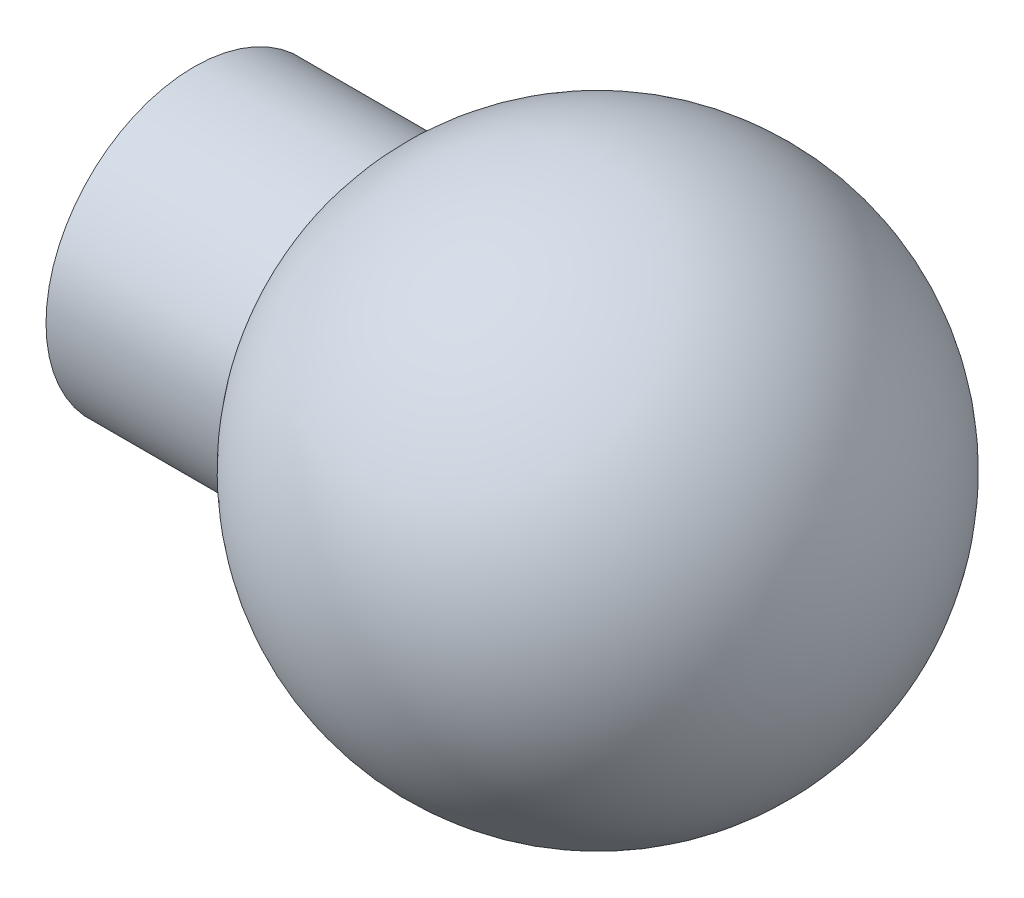
ISO-10303-21;
HEADER;
FILE_DESCRIPTION(('STEP AP214'),'2;1');
FILE_NAME('part.step','',(''),(''),'','','');
FILE_SCHEMA(('AUTOMOTIVE_DESIGN { 1 0 10303 214 1 1 1 1 }'));
ENDSEC;
DATA;
#1=APPLICATION_CONTEXT('core data for automotive mechanical design processes');
#2=APPLICATION_PROTOCOL_DEFINITION('international standard','automotive_design',2000,#1);
#3=PRODUCT_CONTEXT('',#1,'mechanical');
#4=PRODUCT('Part','Part','',(#3));
#5=PRODUCT_RELATED_PRODUCT_CATEGORY('part','',(#4));
#6=PRODUCT_DEFINITION_FORMATION('','',#4);
#7=PRODUCT_DEFINITION_CONTEXT('part definition',#1,'design');
#8=PRODUCT_DEFINITION('design','',#6,#7);
#9=PRODUCT_DEFINITION_SHAPE('','',#8);
#10=(LENGTH_UNIT() NAMED_UNIT(*) SI_UNIT(.MILLI.,.METRE.));
#11=(NAMED_UNIT(*) PLANE_ANGLE_UNIT() SI_UNIT($,.RADIAN.));
#12=(NAMED_UNIT(*) SI_UNIT($,.STERADIAN.) SOLID_ANGLE_UNIT());
#13=UNCERTAINTY_MEASURE_WITH_UNIT(LENGTH_MEASURE(1.E-05),#10,'distance_accuracy_value','');
#14=(GEOMETRIC_REPRESENTATION_CONTEXT(3) GLOBAL_UNCERTAINTY_ASSIGNED_CONTEXT((#13)) GLOBAL_UNIT_ASSIGNED_CONTEXT((#10,
#11,#12)) REPRESENTATION_CONTEXT('',''));
#15=CARTESIAN_POINT('',(0.,0.,0.));
#16=DIRECTION('',(0.,0.,1.));
#17=DIRECTION('',(1.,0.,0.));
#18=AXIS2_PLACEMENT_3D('',#15,#16,#17);
#19=CARTESIAN_POINT('',(-30.,0.,0.));
#20=DIRECTION('',(1.,0.,0.));
#21=DIRECTION('',(0.,0.,-1.));
#22=AXIS2_PLACEMENT_3D('',#19,#20,#21);
#23=CYLINDRICAL_SURFACE('',#22,11.);
#24=CARTESIAN_POINT('',(-30.,0.,0.));
#25=DIRECTION('',(1.,0.,0.));
#26=DIRECTION('',(0.,0.,-1.));
#27=AXIS2_PLACEMENT_3D('',#24,#25,#26);
#28=CIRCLE('',#27,11.);
#29=CARTESIAN_POINT('',(-30.,0.,-11.));
#30=VERTEX_POINT('',#29);
#31=EDGE_CURVE('E44',#30,#30,#28,.T.);
#32=ORIENTED_EDGE('',*,*,#31,.T.);
#33=EDGE_LOOP('',(#32));
#34=FACE_BOUND('',#33,.T.);
#35=CARTESIAN_POINT('',(-16.7032930884901,0.,0.));
#36=DIRECTION('',(1.,0.,0.));
#37=DIRECTION('',(0.,0.,-1.));
#38=AXIS2_PLACEMENT_3D('',#35,#36,#37);
#39=CIRCLE('',#38,11.);
#40=CARTESIAN_POINT('',(-16.7032930884901,0.,-11.));
#41=VERTEX_POINT('',#40);
#42=EDGE_CURVE('E11',#41,#41,#39,.T.);
#43=ORIENTED_EDGE('',*,*,#42,.F.);
#44=EDGE_LOOP('',(#43));
#45=FACE_BOUND('',#44,.T.);
#46=ADVANCED_FACE('F36',(#34,#45),#23,.T.);
#47=CARTESIAN_POINT('',(-30.,0.,0.));
#48=DIRECTION('',(1.,0.,0.));
#49=DIRECTION('',(0.,0.,-1.));
#50=AXIS2_PLACEMENT_3D('',#47,#48,#49);
#51=PLANE('',#50);
#52=DIRECTION('',(0.,0.,-1.));
#53=VECTOR('',#52,1.);
#54=CARTESIAN_POINT('',(-30.,3.5,-3.5));
#55=LINE('',#54,#53);
#56=CARTESIAN_POINT('',(-30.,3.5,3.5));
#57=VERTEX_POINT('',#56);
#58=CARTESIAN_POINT('',(-30.,3.5,-3.5));
#59=VERTEX_POINT('',#58);
#60=EDGE_CURVE('E86',#57,#59,#55,.T.);
#61=ORIENTED_EDGE('',*,*,#60,.F.);
#62=DIRECTION('',(0.,1.,0.));
#63=VECTOR('',#62,1.);
#64=CARTESIAN_POINT('',(-30.,-3.5,3.5));
#65=LINE('',#64,#63);
#66=CARTESIAN_POINT('',(-30.,-3.5,3.5));
#67=VERTEX_POINT('',#66);
#68=EDGE_CURVE('E51',#67,#57,#65,.T.);
#69=ORIENTED_EDGE('',*,*,#68,.F.);
#70=DIRECTION('',(0.,0.,1.));
#71=VECTOR('',#70,1.);
#72=CARTESIAN_POINT('',(-30.,-3.5,-3.5));
#73=LINE('',#72,#71);
#74=CARTESIAN_POINT('',(-30.,-3.5,-3.5));
#75=VERTEX_POINT('',#74);
#76=EDGE_CURVE('E102',#75,#67,#73,.T.);
#77=ORIENTED_EDGE('',*,*,#76,.F.);
#78=DIRECTION('',(0.,-1.,0.));
#79=VECTOR('',#78,1.);
#80=CARTESIAN_POINT('',(-30.,-3.5,-3.5));
#81=LINE('',#80,#79);
#82=EDGE_CURVE('E108',#59,#75,#81,.T.);
#83=ORIENTED_EDGE('',*,*,#82,.F.);
#84=EDGE_LOOP('',(#61,#69,#77,#83));
#85=FACE_BOUND('',#84,.T.);
#86=ORIENTED_EDGE('',*,*,#31,.F.);
#87=EDGE_LOOP('',(#86));
#88=FACE_BOUND('',#87,.T.);
#89=ADVANCED_FACE('F118',(#85,#88),#51,.F.);
#90=CARTESIAN_POINT('',(0.,0.,0.));
#91=DIRECTION('',(-1.,0.,0.));
#92=DIRECTION('',(0.,1.,0.));
#93=AXIS2_PLACEMENT_3D('',#90,#91,#92);
#94=SPHERICAL_SURFACE('',#93,20.);
#95=ORIENTED_EDGE('',*,*,#42,.T.);
#96=EDGE_LOOP('',(#95));
#97=FACE_BOUND('',#96,.T.);
#98=ADVANCED_FACE('F38',(#97),#94,.T.);
#99=CARTESIAN_POINT('',(-24.,-3.5,3.5));
#100=DIRECTION('',(0.,0.,1.));
#101=DIRECTION('',(1.,0.,0.));
#102=AXIS2_PLACEMENT_3D('',#99,#100,#101);
#103=PLANE('',#102);
#104=ORIENTED_EDGE('',*,*,#68,.T.);
#105=DIRECTION('',(-1.,0.,0.));
#106=VECTOR('',#105,1.);
#107=CARTESIAN_POINT('',(-24.,3.5,3.5));
#108=LINE('',#107,#106);
#109=CARTESIAN_POINT('',(-24.,3.5,3.5));
#110=VERTEX_POINT('',#109);
#111=EDGE_CURVE('E74',#110,#57,#108,.T.);
#112=ORIENTED_EDGE('',*,*,#111,.F.);
#113=DIRECTION('',(0.,1.,0.));
#114=VECTOR('',#113,1.);
#115=CARTESIAN_POINT('',(-24.,-3.5,3.5));
#116=LINE('',#115,#114);
#117=CARTESIAN_POINT('',(-24.,-3.5,3.5));
#118=VERTEX_POINT('',#117);
#119=EDGE_CURVE('E100',#118,#110,#116,.T.);
#120=ORIENTED_EDGE('',*,*,#119,.F.);
#121=DIRECTION('',(-1.,0.,0.));
#122=VECTOR('',#121,1.);
#123=CARTESIAN_POINT('',(-24.,-3.5,3.5));
#124=LINE('',#123,#122);
#125=EDGE_CURVE('E59',#118,#67,#124,.T.);
#126=ORIENTED_EDGE('',*,*,#125,.T.);
#127=EDGE_LOOP('',(#104,#112,#120,#126));
#128=FACE_BOUND('',#127,.T.);
#129=ADVANCED_FACE('F126',(#128),#103,.F.);
#130=CARTESIAN_POINT('',(-24.,-3.5,-3.5));
#131=DIRECTION('',(0.,-1.,0.));
#132=DIRECTION('',(0.,0.,-1.));
#133=AXIS2_PLACEMENT_3D('',#130,#131,#132);
#134=PLANE('',#133);
#135=ORIENTED_EDGE('',*,*,#76,.T.);
#136=ORIENTED_EDGE('',*,*,#125,.F.);
#137=DIRECTION('',(0.,0.,1.));
#138=VECTOR('',#137,1.);
#139=CARTESIAN_POINT('',(-24.,-3.5,-3.5));
#140=LINE('',#139,#138);
#141=CARTESIAN_POINT('',(-24.,-3.5,-3.5));
#142=VERTEX_POINT('',#141);
#143=EDGE_CURVE('E97',#142,#118,#140,.T.);
#144=ORIENTED_EDGE('',*,*,#143,.F.);
#145=DIRECTION('',(-1.,0.,0.));
#146=VECTOR('',#145,1.);
#147=CARTESIAN_POINT('',(-24.,-3.5,-3.5));
#148=LINE('',#147,#146);
#149=EDGE_CURVE('E90',#142,#75,#148,.T.);
#150=ORIENTED_EDGE('',*,*,#149,.T.);
#151=EDGE_LOOP('',(#135,#136,#144,#150));
#152=FACE_BOUND('',#151,.T.);
#153=ADVANCED_FACE('F131',(#152),#134,.F.);
#154=CARTESIAN_POINT('',(-24.,-3.5,-3.5));
#155=DIRECTION('',(0.,0.,-1.));
#156=DIRECTION('',(-1.,0.,0.));
#157=AXIS2_PLACEMENT_3D('',#154,#155,#156);
#158=PLANE('',#157);
#159=ORIENTED_EDGE('',*,*,#82,.T.);
#160=ORIENTED_EDGE('',*,*,#149,.F.);
#161=DIRECTION('',(0.,-1.,0.));
#162=VECTOR('',#161,1.);
#163=CARTESIAN_POINT('',(-24.,-3.5,-3.5));
#164=LINE('',#163,#162);
#165=CARTESIAN_POINT('',(-24.,3.5,-3.5));
#166=VERTEX_POINT('',#165);
#167=EDGE_CURVE('E93',#166,#142,#164,.T.);
#168=ORIENTED_EDGE('',*,*,#167,.F.);
#169=DIRECTION('',(-1.,0.,0.));
#170=VECTOR('',#169,1.);
#171=CARTESIAN_POINT('',(-24.,3.5,-3.5));
#172=LINE('',#171,#170);
#173=EDGE_CURVE('E79',#166,#59,#172,.T.);
#174=ORIENTED_EDGE('',*,*,#173,.T.);
#175=EDGE_LOOP('',(#159,#160,#168,#174));
#176=FACE_BOUND('',#175,.T.);
#177=ADVANCED_FACE('F94',(#176),#158,.F.);
#178=CARTESIAN_POINT('',(-24.,3.5,-3.5));
#179=DIRECTION('',(0.,1.,0.));
#180=DIRECTION('',(0.,0.,1.));
#181=AXIS2_PLACEMENT_3D('',#178,#179,#180);
#182=PLANE('',#181);
#183=ORIENTED_EDGE('',*,*,#60,.T.);
#184=ORIENTED_EDGE('',*,*,#173,.F.);
#185=DIRECTION('',(0.,0.,-1.));
#186=VECTOR('',#185,1.);
#187=CARTESIAN_POINT('',(-24.,3.5,-3.5));
#188=LINE('',#187,#186);
#189=EDGE_CURVE('E83',#110,#166,#188,.T.);
#190=ORIENTED_EDGE('',*,*,#189,.F.);
#191=ORIENTED_EDGE('',*,*,#111,.T.);
#192=EDGE_LOOP('',(#183,#184,#190,#191));
#193=FACE_BOUND('',#192,.T.);
#194=ADVANCED_FACE('F81',(#193),#182,.F.);
#195=CARTESIAN_POINT('',(-24.,0.,0.));
#196=DIRECTION('',(1.,0.,0.));
#197=DIRECTION('',(0.,0.,-1.));
#198=AXIS2_PLACEMENT_3D('',#195,#196,#197);
#199=PLANE('',#198);
#200=ORIENTED_EDGE('',*,*,#119,.T.);
#201=ORIENTED_EDGE('',*,*,#189,.T.);
#202=ORIENTED_EDGE('',*,*,#167,.T.);
#203=ORIENTED_EDGE('',*,*,#143,.T.);
#204=EDGE_LOOP('',(#200,#201,#202,#203));
#205=FACE_BOUND('',#204,.T.);
#206=ADVANCED_FACE('F99',(#205),#199,.F.);
#207=CLOSED_SHELL('',(#46,#89,#98,#129,#153,#177,#194,#206));
#208=MANIFOLD_SOLID_BREP('B2',#207);
#209=ADVANCED_BREP_SHAPE_REPRESENTATION('',(#18,#208),#14);
#210=SHAPE_DEFINITION_REPRESENTATION(#9,#209);
ENDSEC;
END-ISO-10303-21;
